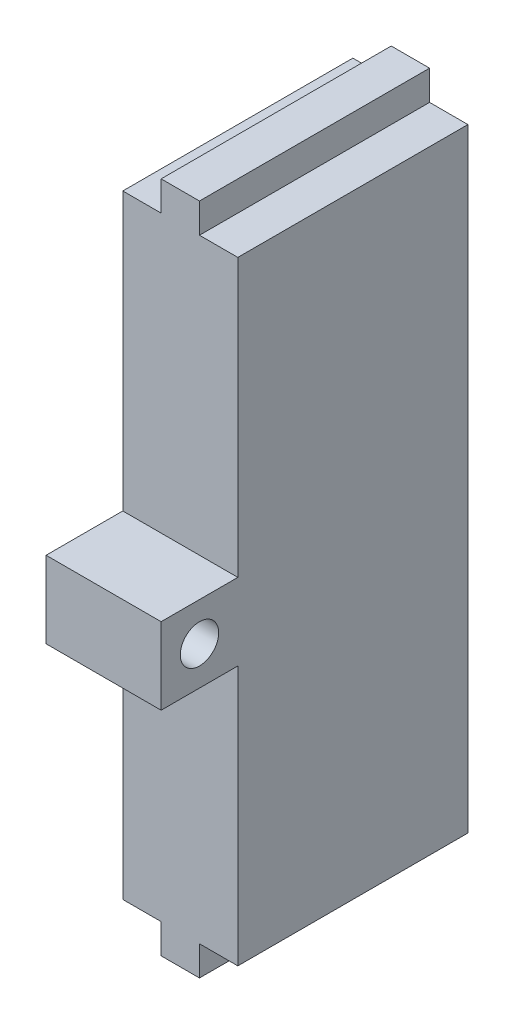
ISO-10303-21;
HEADER;
FILE_DESCRIPTION(('STEP AP214'),'2;1');
FILE_NAME('part.step','',(''),(''),'','','');
FILE_SCHEMA(('AUTOMOTIVE_DESIGN { 1 0 10303 214 1 1 1 1 }'));
ENDSEC;
DATA;
#1=APPLICATION_CONTEXT('core data for automotive mechanical design processes');
#2=APPLICATION_PROTOCOL_DEFINITION('international standard','automotive_design',2000,#1);
#3=PRODUCT_CONTEXT('',#1,'mechanical');
#4=PRODUCT('Part','Part','',(#3));
#5=PRODUCT_RELATED_PRODUCT_CATEGORY('part','',(#4));
#6=PRODUCT_DEFINITION_FORMATION('','',#4);
#7=PRODUCT_DEFINITION_CONTEXT('part definition',#1,'design');
#8=PRODUCT_DEFINITION('design','',#6,#7);
#9=PRODUCT_DEFINITION_SHAPE('','',#8);
#10=(LENGTH_UNIT() NAMED_UNIT(*) SI_UNIT(.MILLI.,.METRE.));
#11=(NAMED_UNIT(*) PLANE_ANGLE_UNIT() SI_UNIT($,.RADIAN.));
#12=(NAMED_UNIT(*) SI_UNIT($,.STERADIAN.) SOLID_ANGLE_UNIT());
#13=UNCERTAINTY_MEASURE_WITH_UNIT(LENGTH_MEASURE(1.E-05),#10,'distance_accuracy_value','');
#14=(GEOMETRIC_REPRESENTATION_CONTEXT(3) GLOBAL_UNCERTAINTY_ASSIGNED_CONTEXT((#13)) GLOBAL_UNIT_ASSIGNED_CONTEXT((#10,
#11,#12)) REPRESENTATION_CONTEXT('',''));
#15=CARTESIAN_POINT('',(0.,0.,0.));
#16=DIRECTION('',(0.,0.,1.));
#17=DIRECTION('',(1.,0.,0.));
#18=AXIS2_PLACEMENT_3D('',#15,#16,#17);
#19=CARTESIAN_POINT('',(0.,0.,150.));
#20=DIRECTION('',(0.,0.,1.));
#21=DIRECTION('',(1.,0.,0.));
#22=AXIS2_PLACEMENT_3D('',#19,#20,#21);
#23=PLANE('',#22);
#24=DIRECTION('',(-1.,0.,0.));
#25=VECTOR('',#24,1.);
#26=CARTESIAN_POINT('',(0.,-180.663345578367,150.));
#27=LINE('',#26,#25);
#28=CARTESIAN_POINT('',(75.,-180.663345578367,150.));
#29=VERTEX_POINT('',#28);
#30=CARTESIAN_POINT('',(0.,-180.663345578367,150.));
#31=VERTEX_POINT('',#30);
#32=EDGE_CURVE('E53',#29,#31,#27,.T.);
#33=ORIENTED_EDGE('',*,*,#32,.F.);
#34=DIRECTION('',(0.,1.,0.));
#35=VECTOR('',#34,1.);
#36=CARTESIAN_POINT('',(75.,0.,150.));
#37=LINE('',#36,#35);
#38=CARTESIAN_POINT('',(75.,0.,150.));
#39=VERTEX_POINT('',#38);
#40=EDGE_CURVE('E199',#29,#39,#37,.T.);
#41=ORIENTED_EDGE('',*,*,#40,.T.);
#42=DIRECTION('',(-1.,0.,0.));
#43=VECTOR('',#42,1.);
#44=CARTESIAN_POINT('',(50.,0.,150.));
#45=LINE('',#44,#43);
#46=CARTESIAN_POINT('',(50.,0.,150.));
#47=VERTEX_POINT('',#46);
#48=EDGE_CURVE('E202',#39,#47,#45,.T.);
#49=ORIENTED_EDGE('',*,*,#48,.T.);
#50=DIRECTION('',(0.,1.,0.));
#51=VECTOR('',#50,1.);
#52=CARTESIAN_POINT('',(50.,19.3366544216332,150.));
#53=LINE('',#52,#51);
#54=CARTESIAN_POINT('',(50.,19.3366544216332,150.));
#55=VERTEX_POINT('',#54);
#56=EDGE_CURVE('E204',#47,#55,#53,.T.);
#57=ORIENTED_EDGE('',*,*,#56,.T.);
#58=DIRECTION('',(-1.,0.,0.));
#59=VECTOR('',#58,1.);
#60=CARTESIAN_POINT('',(25.,19.3366544216332,150.));
#61=LINE('',#60,#59);
#62=CARTESIAN_POINT('',(25.,19.3366544216332,150.));
#63=VERTEX_POINT('',#62);
#64=EDGE_CURVE('E206',#55,#63,#61,.T.);
#65=ORIENTED_EDGE('',*,*,#64,.T.);
#66=DIRECTION('',(0.,-1.,0.));
#67=VECTOR('',#66,1.);
#68=CARTESIAN_POINT('',(25.,0.,150.));
#69=LINE('',#68,#67);
#70=CARTESIAN_POINT('',(25.,0.,150.));
#71=VERTEX_POINT('',#70);
#72=EDGE_CURVE('E208',#63,#71,#69,.T.);
#73=ORIENTED_EDGE('',*,*,#72,.T.);
#74=DIRECTION('',(-1.,0.,0.));
#75=VECTOR('',#74,1.);
#76=CARTESIAN_POINT('',(0.,0.,150.));
#77=LINE('',#76,#75);
#78=CARTESIAN_POINT('',(0.,0.,150.));
#79=VERTEX_POINT('',#78);
#80=EDGE_CURVE('E183',#71,#79,#77,.T.);
#81=ORIENTED_EDGE('',*,*,#80,.T.);
#82=DIRECTION('',(0.,-1.,0.));
#83=VECTOR('',#82,1.);
#84=CARTESIAN_POINT('',(0.,0.,150.));
#85=LINE('',#84,#83);
#86=EDGE_CURVE('E187',#79,#31,#85,.T.);
#87=ORIENTED_EDGE('',*,*,#86,.T.);
#88=EDGE_LOOP('',(#33,#41,#49,#57,#65,#73,#81,#87));
#89=FACE_BOUND('',#88,.T.);
#90=ADVANCED_FACE('F37',(#89),#23,.T.);
#91=CARTESIAN_POINT('',(0.,0.,150.));
#92=DIRECTION('',(0.,-1.,0.));
#93=DIRECTION('',(1.,0.,0.));
#94=AXIS2_PLACEMENT_3D('',#91,#92,#93);
#95=PLANE('',#94);
#96=DIRECTION('',(-1.,0.,0.));
#97=VECTOR('',#96,1.);
#98=CARTESIAN_POINT('',(0.,0.,0.));
#99=LINE('',#98,#97);
#100=CARTESIAN_POINT('',(25.,0.,0.));
#101=VERTEX_POINT('',#100);
#102=CARTESIAN_POINT('',(0.,0.,0.));
#103=VERTEX_POINT('',#102);
#104=EDGE_CURVE('E174',#101,#103,#99,.T.);
#105=ORIENTED_EDGE('',*,*,#104,.T.);
#106=DIRECTION('',(0.,0.,-1.));
#107=VECTOR('',#106,1.);
#108=CARTESIAN_POINT('',(0.,0.,150.));
#109=LINE('',#108,#107);
#110=EDGE_CURVE('E11',#79,#103,#109,.T.);
#111=ORIENTED_EDGE('',*,*,#110,.F.);
#112=ORIENTED_EDGE('',*,*,#80,.F.);
#113=DIRECTION('',(0.,0.,-1.));
#114=VECTOR('',#113,1.);
#115=CARTESIAN_POINT('',(25.,0.,150.));
#116=LINE('',#115,#114);
#117=EDGE_CURVE('E209',#71,#101,#116,.T.);
#118=ORIENTED_EDGE('',*,*,#117,.T.);
#119=EDGE_LOOP('',(#105,#111,#112,#118));
#120=FACE_BOUND('',#119,.T.);
#121=ADVANCED_FACE('F39',(#120),#95,.F.);
#122=CARTESIAN_POINT('',(0.,0.,150.));
#123=DIRECTION('',(1.,0.,0.));
#124=DIRECTION('',(0.,1.,0.));
#125=AXIS2_PLACEMENT_3D('',#122,#123,#124);
#126=PLANE('',#125);
#127=CARTESIAN_POINT('',(0.,-205.663345578367,175.));
#128=DIRECTION('',(-1.,0.,0.));
#129=DIRECTION('',(0.,-1.,0.));
#130=AXIS2_PLACEMENT_3D('',#127,#128,#129);
#131=CIRCLE('',#130,12.5);
#132=CARTESIAN_POINT('',(0.,-218.163345578367,175.));
#133=VERTEX_POINT('',#132);
#134=EDGE_CURVE('E297',#133,#133,#131,.T.);
#135=ORIENTED_EDGE('',*,*,#134,.F.);
#136=EDGE_LOOP('',(#135));
#137=FACE_BOUND('',#136,.T.);
#138=DIRECTION('',(0.,-1.,0.));
#139=VECTOR('',#138,1.);
#140=CARTESIAN_POINT('',(0.,0.,0.));
#141=LINE('',#140,#139);
#142=CARTESIAN_POINT('',(0.,-400.,0.));
#143=VERTEX_POINT('',#142);
#144=EDGE_CURVE('E177',#103,#143,#141,.T.);
#145=ORIENTED_EDGE('',*,*,#144,.T.);
#146=DIRECTION('',(0.,0.,-1.));
#147=VECTOR('',#146,1.);
#148=CARTESIAN_POINT('',(0.,-400.,150.));
#149=LINE('',#148,#147);
#150=CARTESIAN_POINT('',(0.,-400.,150.));
#151=VERTEX_POINT('',#150);
#152=EDGE_CURVE('E46',#151,#143,#149,.T.);
#153=ORIENTED_EDGE('',*,*,#152,.F.);
#154=CARTESIAN_POINT('',(0.,-230.663345578367,150.));
#155=VERTEX_POINT('',#154);
#156=EDGE_CURVE('E173',#155,#151,#85,.T.);
#157=ORIENTED_EDGE('',*,*,#156,.F.);
#158=DIRECTION('',(0.,0.,-1.));
#159=VECTOR('',#158,1.);
#160=CARTESIAN_POINT('',(0.,-230.663345578367,200.));
#161=LINE('',#160,#159);
#162=CARTESIAN_POINT('',(0.,-230.663345578367,200.));
#163=VERTEX_POINT('',#162);
#164=EDGE_CURVE('E155',#163,#155,#161,.T.);
#165=ORIENTED_EDGE('',*,*,#164,.F.);
#166=DIRECTION('',(0.,-1.,0.));
#167=VECTOR('',#166,1.);
#168=CARTESIAN_POINT('',(0.,-180.663345578367,200.));
#169=LINE('',#168,#167);
#170=CARTESIAN_POINT('',(0.,-180.663345578367,200.));
#171=VERTEX_POINT('',#170);
#172=EDGE_CURVE('E161',#171,#163,#169,.T.);
#173=ORIENTED_EDGE('',*,*,#172,.F.);
#174=DIRECTION('',(0.,0.,-1.));
#175=VECTOR('',#174,1.);
#176=CARTESIAN_POINT('',(0.,-180.663345578367,200.));
#177=LINE('',#176,#175);
#178=EDGE_CURVE('E301',#171,#31,#177,.T.);
#179=ORIENTED_EDGE('',*,*,#178,.T.);
#180=ORIENTED_EDGE('',*,*,#86,.F.);
#181=ORIENTED_EDGE('',*,*,#110,.T.);
#182=EDGE_LOOP('',(#145,#153,#157,#165,#173,#179,#180,#181));
#183=FACE_BOUND('',#182,.T.);
#184=ADVANCED_FACE('F171',(#137,#183),#126,.F.);
#185=CARTESIAN_POINT('',(0.,-400.,150.));
#186=DIRECTION('',(0.,1.,0.));
#187=DIRECTION('',(0.,0.,1.));
#188=AXIS2_PLACEMENT_3D('',#185,#186,#187);
#189=PLANE('',#188);
#190=DIRECTION('',(1.,0.,0.));
#191=VECTOR('',#190,1.);
#192=CARTESIAN_POINT('',(0.,-400.,0.));
#193=LINE('',#192,#191);
#194=CARTESIAN_POINT('',(25.,-400.,0.));
#195=VERTEX_POINT('',#194);
#196=EDGE_CURVE('E212',#143,#195,#193,.T.);
#197=ORIENTED_EDGE('',*,*,#196,.T.);
#198=DIRECTION('',(0.,0.,-1.));
#199=VECTOR('',#198,1.);
#200=CARTESIAN_POINT('',(25.,-400.,150.));
#201=LINE('',#200,#199);
#202=CARTESIAN_POINT('',(25.,-400.,150.));
#203=VERTEX_POINT('',#202);
#204=EDGE_CURVE('E257',#203,#195,#201,.T.);
#205=ORIENTED_EDGE('',*,*,#204,.F.);
#206=DIRECTION('',(1.,0.,0.));
#207=VECTOR('',#206,1.);
#208=CARTESIAN_POINT('',(0.,-400.,150.));
#209=LINE('',#208,#207);
#210=EDGE_CURVE('E189',#151,#203,#209,.T.);
#211=ORIENTED_EDGE('',*,*,#210,.F.);
#212=ORIENTED_EDGE('',*,*,#152,.T.);
#213=EDGE_LOOP('',(#197,#205,#211,#212));
#214=FACE_BOUND('',#213,.T.);
#215=ADVANCED_FACE('F264',(#214),#189,.F.);
#216=CARTESIAN_POINT('',(25.,-400.,150.));
#217=DIRECTION('',(1.,0.,0.));
#218=DIRECTION('',(0.,1.,0.));
#219=AXIS2_PLACEMENT_3D('',#216,#217,#218);
#220=PLANE('',#219);
#221=DIRECTION('',(0.,-1.,0.));
#222=VECTOR('',#221,1.);
#223=CARTESIAN_POINT('',(25.,-400.,0.));
#224=LINE('',#223,#222);
#225=CARTESIAN_POINT('',(25.0000000000001,-419.336654421633,0.));
#226=VERTEX_POINT('',#225);
#227=EDGE_CURVE('E214',#195,#226,#224,.T.);
#228=ORIENTED_EDGE('',*,*,#227,.T.);
#229=DIRECTION('',(0.,0.,-1.));
#230=VECTOR('',#229,1.);
#231=CARTESIAN_POINT('',(25.0000000000001,-419.336654421633,150.));
#232=LINE('',#231,#230);
#233=CARTESIAN_POINT('',(25.0000000000001,-419.336654421633,150.));
#234=VERTEX_POINT('',#233);
#235=EDGE_CURVE('E254',#234,#226,#232,.T.);
#236=ORIENTED_EDGE('',*,*,#235,.F.);
#237=DIRECTION('',(0.,-1.,0.));
#238=VECTOR('',#237,1.);
#239=CARTESIAN_POINT('',(25.,-400.,150.));
#240=LINE('',#239,#238);
#241=EDGE_CURVE('E191',#203,#234,#240,.T.);
#242=ORIENTED_EDGE('',*,*,#241,.F.);
#243=ORIENTED_EDGE('',*,*,#204,.T.);
#244=EDGE_LOOP('',(#228,#236,#242,#243));
#245=FACE_BOUND('',#244,.T.);
#246=ADVANCED_FACE('F274',(#245),#220,.F.);
#247=CARTESIAN_POINT('',(25.0000000000001,-419.336654421633,150.));
#248=DIRECTION('',(0.,1.,0.));
#249=DIRECTION('',(0.,0.,1.));
#250=AXIS2_PLACEMENT_3D('',#247,#248,#249);
#251=PLANE('',#250);
#252=DIRECTION('',(1.,0.,0.));
#253=VECTOR('',#252,1.);
#254=CARTESIAN_POINT('',(25.0000000000001,-419.336654421633,0.));
#255=LINE('',#254,#253);
#256=CARTESIAN_POINT('',(50.0000000000001,-419.336654421633,0.));
#257=VERTEX_POINT('',#256);
#258=EDGE_CURVE('E216',#226,#257,#255,.T.);
#259=ORIENTED_EDGE('',*,*,#258,.T.);
#260=DIRECTION('',(0.,0.,-1.));
#261=VECTOR('',#260,1.);
#262=CARTESIAN_POINT('',(50.0000000000001,-419.336654421633,150.));
#263=LINE('',#262,#261);
#264=CARTESIAN_POINT('',(50.0000000000001,-419.336654421633,150.));
#265=VERTEX_POINT('',#264);
#266=EDGE_CURVE('E251',#265,#257,#263,.T.);
#267=ORIENTED_EDGE('',*,*,#266,.F.);
#268=DIRECTION('',(1.,0.,0.));
#269=VECTOR('',#268,1.);
#270=CARTESIAN_POINT('',(25.0000000000001,-419.336654421633,150.));
#271=LINE('',#270,#269);
#272=EDGE_CURVE('E193',#234,#265,#271,.T.);
#273=ORIENTED_EDGE('',*,*,#272,.F.);
#274=ORIENTED_EDGE('',*,*,#235,.T.);
#275=EDGE_LOOP('',(#259,#267,#273,#274));
#276=FACE_BOUND('',#275,.T.);
#277=ADVANCED_FACE('F278',(#276),#251,.F.);
#278=CARTESIAN_POINT('',(50.0000000000001,-419.336654421633,150.));
#279=DIRECTION('',(-1.,0.,0.));
#280=DIRECTION('',(0.,0.,1.));
#281=AXIS2_PLACEMENT_3D('',#278,#279,#280);
#282=PLANE('',#281);
#283=DIRECTION('',(0.,1.,0.));
#284=VECTOR('',#283,1.);
#285=CARTESIAN_POINT('',(50.0000000000001,-419.336654421633,0.));
#286=LINE('',#285,#284);
#287=CARTESIAN_POINT('',(50.0000000000001,-400.,0.));
#288=VERTEX_POINT('',#287);
#289=EDGE_CURVE('E218',#257,#288,#286,.T.);
#290=ORIENTED_EDGE('',*,*,#289,.T.);
#291=DIRECTION('',(0.,0.,-1.));
#292=VECTOR('',#291,1.);
#293=CARTESIAN_POINT('',(50.0000000000001,-400.,150.));
#294=LINE('',#293,#292);
#295=CARTESIAN_POINT('',(50.0000000000001,-400.,150.));
#296=VERTEX_POINT('',#295);
#297=EDGE_CURVE('E248',#296,#288,#294,.T.);
#298=ORIENTED_EDGE('',*,*,#297,.F.);
#299=DIRECTION('',(0.,1.,0.));
#300=VECTOR('',#299,1.);
#301=CARTESIAN_POINT('',(50.0000000000001,-419.336654421633,150.));
#302=LINE('',#301,#300);
#303=EDGE_CURVE('E195',#265,#296,#302,.T.);
#304=ORIENTED_EDGE('',*,*,#303,.F.);
#305=ORIENTED_EDGE('',*,*,#266,.T.);
#306=EDGE_LOOP('',(#290,#298,#304,#305));
#307=FACE_BOUND('',#306,.T.);
#308=ADVANCED_FACE('F286',(#307),#282,.F.);
#309=CARTESIAN_POINT('',(50.0000000000001,-400.,150.));
#310=DIRECTION('',(0.,1.,0.));
#311=DIRECTION('',(0.,0.,1.));
#312=AXIS2_PLACEMENT_3D('',#309,#310,#311);
#313=PLANE('',#312);
#314=DIRECTION('',(1.,0.,0.));
#315=VECTOR('',#314,1.);
#316=CARTESIAN_POINT('',(50.0000000000001,-400.,0.));
#317=LINE('',#316,#315);
#318=CARTESIAN_POINT('',(75.0000000000001,-400.,0.));
#319=VERTEX_POINT('',#318);
#320=EDGE_CURVE('E220',#288,#319,#317,.T.);
#321=ORIENTED_EDGE('',*,*,#320,.T.);
#322=DIRECTION('',(0.,0.,-1.));
#323=VECTOR('',#322,1.);
#324=CARTESIAN_POINT('',(75.0000000000001,-400.,150.));
#325=LINE('',#324,#323);
#326=CARTESIAN_POINT('',(75.0000000000001,-400.,150.));
#327=VERTEX_POINT('',#326);
#328=EDGE_CURVE('E245',#327,#319,#325,.T.);
#329=ORIENTED_EDGE('',*,*,#328,.F.);
#330=DIRECTION('',(1.,0.,0.));
#331=VECTOR('',#330,1.);
#332=CARTESIAN_POINT('',(50.0000000000001,-400.,150.));
#333=LINE('',#332,#331);
#334=EDGE_CURVE('E197',#296,#327,#333,.T.);
#335=ORIENTED_EDGE('',*,*,#334,.F.);
#336=ORIENTED_EDGE('',*,*,#297,.T.);
#337=EDGE_LOOP('',(#321,#329,#335,#336));
#338=FACE_BOUND('',#337,.T.);
#339=ADVANCED_FACE('F289',(#338),#313,.F.);
#340=CARTESIAN_POINT('',(75.,0.,150.));
#341=DIRECTION('',(-1.,0.,0.));
#342=DIRECTION('',(0.,-1.,0.));
#343=AXIS2_PLACEMENT_3D('',#340,#341,#342);
#344=PLANE('',#343);
#345=CARTESIAN_POINT('',(75.,-205.663345578367,175.));
#346=DIRECTION('',(-1.,0.,0.));
#347=DIRECTION('',(0.,-1.,0.));
#348=AXIS2_PLACEMENT_3D('',#345,#346,#347);
#349=CIRCLE('',#348,12.5);
#350=CARTESIAN_POINT('',(75.,-218.163345578367,175.));
#351=VERTEX_POINT('',#350);
#352=EDGE_CURVE('E41',#351,#351,#349,.T.);
#353=ORIENTED_EDGE('',*,*,#352,.T.);
#354=EDGE_LOOP('',(#353));
#355=FACE_BOUND('',#354,.T.);
#356=DIRECTION('',(0.,1.,0.));
#357=VECTOR('',#356,1.);
#358=CARTESIAN_POINT('',(75.,0.,0.));
#359=LINE('',#358,#357);
#360=CARTESIAN_POINT('',(75.,0.,0.));
#361=VERTEX_POINT('',#360);
#362=EDGE_CURVE('E222',#319,#361,#359,.T.);
#363=ORIENTED_EDGE('',*,*,#362,.T.);
#364=DIRECTION('',(0.,0.,-1.));
#365=VECTOR('',#364,1.);
#366=CARTESIAN_POINT('',(75.,0.,150.));
#367=LINE('',#366,#365);
#368=EDGE_CURVE('E242',#39,#361,#367,.T.);
#369=ORIENTED_EDGE('',*,*,#368,.F.);
#370=ORIENTED_EDGE('',*,*,#40,.F.);
#371=DIRECTION('',(0.,0.,-1.));
#372=VECTOR('',#371,1.);
#373=CARTESIAN_POINT('',(75.,-180.663345578367,200.));
#374=LINE('',#373,#372);
#375=CARTESIAN_POINT('',(75.,-180.663345578367,200.));
#376=VERTEX_POINT('',#375);
#377=EDGE_CURVE('E179',#376,#29,#374,.T.);
#378=ORIENTED_EDGE('',*,*,#377,.F.);
#379=DIRECTION('',(0.,1.,0.));
#380=VECTOR('',#379,1.);
#381=CARTESIAN_POINT('',(75.,-180.663345578367,200.));
#382=LINE('',#381,#380);
#383=CARTESIAN_POINT('',(75.0000000000001,-230.663345578367,200.));
#384=VERTEX_POINT('',#383);
#385=EDGE_CURVE('E160',#384,#376,#382,.T.);
#386=ORIENTED_EDGE('',*,*,#385,.F.);
#387=DIRECTION('',(0.,0.,-1.));
#388=VECTOR('',#387,1.);
#389=CARTESIAN_POINT('',(75.0000000000001,-230.663345578367,200.));
#390=LINE('',#389,#388);
#391=CARTESIAN_POINT('',(75.0000000000001,-230.663345578367,150.));
#392=VERTEX_POINT('',#391);
#393=EDGE_CURVE('E157',#384,#392,#390,.T.);
#394=ORIENTED_EDGE('',*,*,#393,.T.);
#395=EDGE_CURVE('E200',#327,#392,#37,.T.);
#396=ORIENTED_EDGE('',*,*,#395,.F.);
#397=ORIENTED_EDGE('',*,*,#328,.T.);
#398=EDGE_LOOP('',(#363,#369,#370,#378,#386,#394,#396,#397));
#399=FACE_BOUND('',#398,.T.);
#400=ADVANCED_FACE('F293',(#355,#399),#344,.F.);
#401=CARTESIAN_POINT('',(50.,0.,150.));
#402=DIRECTION('',(0.,-1.,0.));
#403=DIRECTION('',(1.,0.,0.));
#404=AXIS2_PLACEMENT_3D('',#401,#402,#403);
#405=PLANE('',#404);
#406=DIRECTION('',(-1.,0.,0.));
#407=VECTOR('',#406,1.);
#408=CARTESIAN_POINT('',(50.,0.,0.));
#409=LINE('',#408,#407);
#410=CARTESIAN_POINT('',(50.,0.,0.));
#411=VERTEX_POINT('',#410);
#412=EDGE_CURVE('E224',#361,#411,#409,.T.);
#413=ORIENTED_EDGE('',*,*,#412,.T.);
#414=DIRECTION('',(0.,0.,-1.));
#415=VECTOR('',#414,1.);
#416=CARTESIAN_POINT('',(50.,0.,150.));
#417=LINE('',#416,#415);
#418=EDGE_CURVE('E239',#47,#411,#417,.T.);
#419=ORIENTED_EDGE('',*,*,#418,.F.);
#420=ORIENTED_EDGE('',*,*,#48,.F.);
#421=ORIENTED_EDGE('',*,*,#368,.T.);
#422=EDGE_LOOP('',(#413,#419,#420,#421));
#423=FACE_BOUND('',#422,.T.);
#424=ADVANCED_FACE('F312',(#423),#405,.F.);
#425=CARTESIAN_POINT('',(50.,19.3366544216332,150.));
#426=DIRECTION('',(-1.,0.,0.));
#427=DIRECTION('',(0.,-1.,0.));
#428=AXIS2_PLACEMENT_3D('',#425,#426,#427);
#429=PLANE('',#428);
#430=DIRECTION('',(0.,1.,0.));
#431=VECTOR('',#430,1.);
#432=CARTESIAN_POINT('',(50.,19.3366544216332,0.));
#433=LINE('',#432,#431);
#434=CARTESIAN_POINT('',(50.,19.3366544216332,0.));
#435=VERTEX_POINT('',#434);
#436=EDGE_CURVE('E226',#411,#435,#433,.T.);
#437=ORIENTED_EDGE('',*,*,#436,.T.);
#438=DIRECTION('',(0.,0.,-1.));
#439=VECTOR('',#438,1.);
#440=CARTESIAN_POINT('',(50.,19.3366544216332,150.));
#441=LINE('',#440,#439);
#442=EDGE_CURVE('E236',#55,#435,#441,.T.);
#443=ORIENTED_EDGE('',*,*,#442,.F.);
#444=ORIENTED_EDGE('',*,*,#56,.F.);
#445=ORIENTED_EDGE('',*,*,#418,.T.);
#446=EDGE_LOOP('',(#437,#443,#444,#445));
#447=FACE_BOUND('',#446,.T.);
#448=ADVANCED_FACE('F316',(#447),#429,.F.);
#449=CARTESIAN_POINT('',(25.,19.3366544216332,150.));
#450=DIRECTION('',(0.,-1.,0.));
#451=DIRECTION('',(0.,0.,-1.));
#452=AXIS2_PLACEMENT_3D('',#449,#450,#451);
#453=PLANE('',#452);
#454=DIRECTION('',(-1.,0.,0.));
#455=VECTOR('',#454,1.);
#456=CARTESIAN_POINT('',(25.,19.3366544216332,0.));
#457=LINE('',#456,#455);
#458=CARTESIAN_POINT('',(25.,19.3366544216332,0.));
#459=VERTEX_POINT('',#458);
#460=EDGE_CURVE('E228',#435,#459,#457,.T.);
#461=ORIENTED_EDGE('',*,*,#460,.T.);
#462=DIRECTION('',(0.,0.,-1.));
#463=VECTOR('',#462,1.);
#464=CARTESIAN_POINT('',(25.,19.3366544216332,150.));
#465=LINE('',#464,#463);
#466=EDGE_CURVE('E233',#63,#459,#465,.T.);
#467=ORIENTED_EDGE('',*,*,#466,.F.);
#468=ORIENTED_EDGE('',*,*,#64,.F.);
#469=ORIENTED_EDGE('',*,*,#442,.T.);
#470=EDGE_LOOP('',(#461,#467,#468,#469));
#471=FACE_BOUND('',#470,.T.);
#472=ADVANCED_FACE('F321',(#471),#453,.F.);
#473=CARTESIAN_POINT('',(25.,0.,150.));
#474=DIRECTION('',(1.,0.,0.));
#475=DIRECTION('',(0.,0.,-1.));
#476=AXIS2_PLACEMENT_3D('',#473,#474,#475);
#477=PLANE('',#476);
#478=DIRECTION('',(0.,-1.,0.));
#479=VECTOR('',#478,1.);
#480=CARTESIAN_POINT('',(25.,0.,0.));
#481=LINE('',#480,#479);
#482=EDGE_CURVE('E186',#459,#101,#481,.T.);
#483=ORIENTED_EDGE('',*,*,#482,.T.);
#484=ORIENTED_EDGE('',*,*,#117,.F.);
#485=ORIENTED_EDGE('',*,*,#72,.F.);
#486=ORIENTED_EDGE('',*,*,#466,.T.);
#487=EDGE_LOOP('',(#483,#484,#485,#486));
#488=FACE_BOUND('',#487,.T.);
#489=ADVANCED_FACE('F327',(#488),#477,.F.);
#490=DIRECTION('',(1.,0.,0.));
#491=VECTOR('',#490,1.);
#492=CARTESIAN_POINT('',(0.,-230.663345578367,150.));
#493=LINE('',#492,#491);
#494=EDGE_CURVE('E61',#155,#392,#493,.T.);
#495=ORIENTED_EDGE('',*,*,#494,.F.);
#496=ORIENTED_EDGE('',*,*,#156,.T.);
#497=ORIENTED_EDGE('',*,*,#210,.T.);
#498=ORIENTED_EDGE('',*,*,#241,.T.);
#499=ORIENTED_EDGE('',*,*,#272,.T.);
#500=ORIENTED_EDGE('',*,*,#303,.T.);
#501=ORIENTED_EDGE('',*,*,#334,.T.);
#502=ORIENTED_EDGE('',*,*,#395,.T.);
#503=EDGE_LOOP('',(#495,#496,#497,#498,#499,#500,#501,#502));
#504=FACE_BOUND('',#503,.T.);
#505=ADVANCED_FACE('F281',(#504),#23,.T.);
#506=CARTESIAN_POINT('',(0.,0.,0.));
#507=DIRECTION('',(0.,0.,1.));
#508=DIRECTION('',(1.,0.,0.));
#509=AXIS2_PLACEMENT_3D('',#506,#507,#508);
#510=PLANE('',#509);
#511=ORIENTED_EDGE('',*,*,#104,.F.);
#512=ORIENTED_EDGE('',*,*,#482,.F.);
#513=ORIENTED_EDGE('',*,*,#460,.F.);
#514=ORIENTED_EDGE('',*,*,#436,.F.);
#515=ORIENTED_EDGE('',*,*,#412,.F.);
#516=ORIENTED_EDGE('',*,*,#362,.F.);
#517=ORIENTED_EDGE('',*,*,#320,.F.);
#518=ORIENTED_EDGE('',*,*,#289,.F.);
#519=ORIENTED_EDGE('',*,*,#258,.F.);
#520=ORIENTED_EDGE('',*,*,#227,.F.);
#521=ORIENTED_EDGE('',*,*,#196,.F.);
#522=ORIENTED_EDGE('',*,*,#144,.F.);
#523=EDGE_LOOP('',(#511,#512,#513,#514,#515,#516,#517,#518,#519,#520,#521,#522));
#524=FACE_BOUND('',#523,.T.);
#525=ADVANCED_FACE('F269',(#524),#510,.F.);
#526=CARTESIAN_POINT('',(0.,-230.663345578367,200.));
#527=DIRECTION('',(0.,1.,0.));
#528=DIRECTION('',(0.,0.,1.));
#529=AXIS2_PLACEMENT_3D('',#526,#527,#528);
#530=PLANE('',#529);
#531=ORIENTED_EDGE('',*,*,#494,.T.);
#532=ORIENTED_EDGE('',*,*,#393,.F.);
#533=DIRECTION('',(1.,0.,0.));
#534=VECTOR('',#533,1.);
#535=CARTESIAN_POINT('',(0.,-230.663345578367,200.));
#536=LINE('',#535,#534);
#537=EDGE_CURVE('E151',#163,#384,#536,.T.);
#538=ORIENTED_EDGE('',*,*,#537,.F.);
#539=ORIENTED_EDGE('',*,*,#164,.T.);
#540=EDGE_LOOP('',(#531,#532,#538,#539));
#541=FACE_BOUND('',#540,.T.);
#542=ADVANCED_FACE('F153',(#541),#530,.F.);
#543=CARTESIAN_POINT('',(0.,-180.663345578367,200.));
#544=DIRECTION('',(0.,-1.,0.));
#545=DIRECTION('',(1.,0.,0.));
#546=AXIS2_PLACEMENT_3D('',#543,#544,#545);
#547=PLANE('',#546);
#548=ORIENTED_EDGE('',*,*,#32,.T.);
#549=ORIENTED_EDGE('',*,*,#178,.F.);
#550=DIRECTION('',(-1.,0.,0.));
#551=VECTOR('',#550,1.);
#552=CARTESIAN_POINT('',(0.,-180.663345578367,200.));
#553=LINE('',#552,#551);
#554=EDGE_CURVE('E166',#376,#171,#553,.T.);
#555=ORIENTED_EDGE('',*,*,#554,.F.);
#556=ORIENTED_EDGE('',*,*,#377,.T.);
#557=EDGE_LOOP('',(#548,#549,#555,#556));
#558=FACE_BOUND('',#557,.T.);
#559=ADVANCED_FACE('F305',(#558),#547,.F.);
#560=CARTESIAN_POINT('',(0.,0.,200.));
#561=DIRECTION('',(0.,0.,1.));
#562=DIRECTION('',(1.,0.,0.));
#563=AXIS2_PLACEMENT_3D('',#560,#561,#562);
#564=PLANE('',#563);
#565=ORIENTED_EDGE('',*,*,#172,.T.);
#566=ORIENTED_EDGE('',*,*,#537,.T.);
#567=ORIENTED_EDGE('',*,*,#385,.T.);
#568=ORIENTED_EDGE('',*,*,#554,.T.);
#569=EDGE_LOOP('',(#565,#566,#567,#568));
#570=FACE_BOUND('',#569,.T.);
#571=ADVANCED_FACE('F164',(#570),#564,.T.);
#572=CARTESIAN_POINT('',(167.,-205.663345578367,175.));
#573=DIRECTION('',(-1.,0.,0.));
#574=DIRECTION('',(0.,-1.,0.));
#575=AXIS2_PLACEMENT_3D('',#572,#573,#574);
#576=CYLINDRICAL_SURFACE('',#575,12.5);
#577=ORIENTED_EDGE('',*,*,#134,.T.);
#578=EDGE_LOOP('',(#577));
#579=FACE_BOUND('',#578,.T.);
#580=ORIENTED_EDGE('',*,*,#352,.F.);
#581=EDGE_LOOP('',(#580));
#582=FACE_BOUND('',#581,.T.);
#583=ADVANCED_FACE('F447',(#579,#582),#576,.F.);
#584=CLOSED_SHELL('',(#90,#121,#184,#215,#246,#277,#308,#339,#400,#424,#448,#472,#489,#505,#525,
#542,#559,#571,#583));
#585=MANIFOLD_SOLID_BREP('B2',#584);
#586=ADVANCED_BREP_SHAPE_REPRESENTATION('',(#18,#585),#14);
#587=SHAPE_DEFINITION_REPRESENTATION(#9,#586);
ENDSEC;
END-ISO-10303-21;
